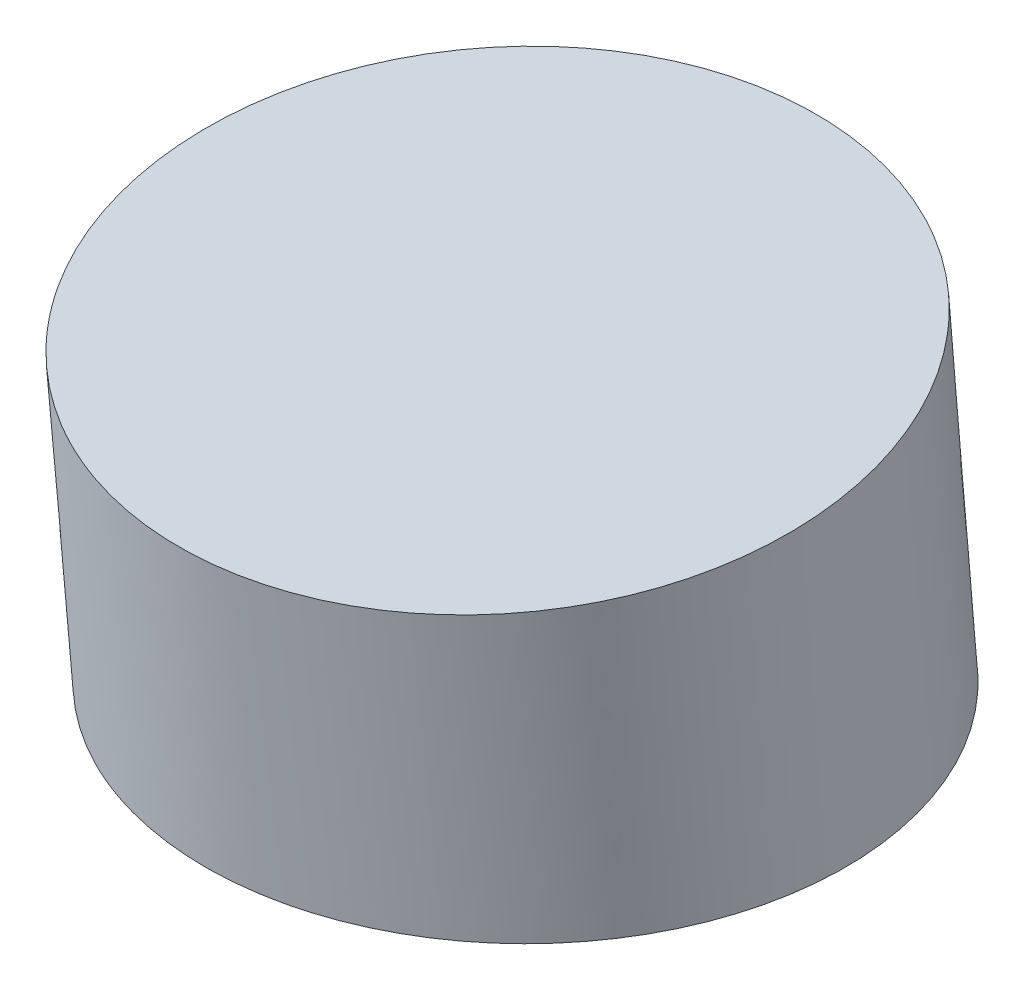
ISO-10303-21;
HEADER;
FILE_DESCRIPTION(('STEP AP214'),'2;1');
FILE_NAME('part.step','',(''),(''),'','','');
FILE_SCHEMA(('AUTOMOTIVE_DESIGN { 1 0 10303 214 1 1 1 1 }'));
ENDSEC;
DATA;
#1=APPLICATION_CONTEXT('core data for automotive mechanical design processes');
#2=APPLICATION_PROTOCOL_DEFINITION('international standard','automotive_design',2000,#1);
#3=PRODUCT_CONTEXT('',#1,'mechanical');
#4=PRODUCT('Part','Part','',(#3));
#5=PRODUCT_RELATED_PRODUCT_CATEGORY('part','',(#4));
#6=PRODUCT_DEFINITION_FORMATION('','',#4);
#7=PRODUCT_DEFINITION_CONTEXT('part definition',#1,'design');
#8=PRODUCT_DEFINITION('design','',#6,#7);
#9=PRODUCT_DEFINITION_SHAPE('','',#8);
#10=(LENGTH_UNIT() NAMED_UNIT(*) SI_UNIT(.MILLI.,.METRE.));
#11=(NAMED_UNIT(*) PLANE_ANGLE_UNIT() SI_UNIT($,.RADIAN.));
#12=(NAMED_UNIT(*) SI_UNIT($,.STERADIAN.) SOLID_ANGLE_UNIT());
#13=UNCERTAINTY_MEASURE_WITH_UNIT(LENGTH_MEASURE(1.E-05),#10,'distance_accuracy_value','');
#14=(GEOMETRIC_REPRESENTATION_CONTEXT(3) GLOBAL_UNCERTAINTY_ASSIGNED_CONTEXT((#13)) GLOBAL_UNIT_ASSIGNED_CONTEXT((#10,
#11,#12)) REPRESENTATION_CONTEXT('',''));
#15=CARTESIAN_POINT('',(0.,0.,0.));
#16=DIRECTION('',(0.,0.,1.));
#17=DIRECTION('',(1.,0.,0.));
#18=AXIS2_PLACEMENT_3D('',#15,#16,#17);
#19=CARTESIAN_POINT('',(0.,4.98097339681643,0.435778705545652));
#20=DIRECTION('',(0.,0.996194698091746,0.0871557427476584));
#21=DIRECTION('',(0.,-0.0871557427476584,0.996194698091746));
#22=AXIS2_PLACEMENT_3D('',#19,#20,#21);
#23=PLANE('',#22);
#24=CARTESIAN_POINT('',(0.,4.98097339681643,0.435778705545652));
#25=DIRECTION('',(0.,0.996194698091746,0.0871557427476584));
#26=DIRECTION('',(0.,-0.0871557427476584,0.996194698091746));
#27=AXIS2_PLACEMENT_3D('',#24,#25,#26);
#28=CIRCLE('',#27,5.);
#29=CARTESIAN_POINT('',(3.08929806545167,5.32362115840022,-3.4807031307812));
#30=VERTEX_POINT('',#29);
#31=EDGE_CURVE('E11',#30,#30,#28,.T.);
#32=ORIENTED_EDGE('',*,*,#31,.T.);
#33=EDGE_LOOP('',(#32));
#34=FACE_BOUND('',#33,.T.);
#35=ADVANCED_FACE('F51',(#34),#23,.T.);
#36=CARTESIAN_POINT('',(0.,0.,0.));
#37=DIRECTION('',(0.,1.,0.));
#38=DIRECTION('',(0.,0.,1.));
#39=AXIS2_PLACEMENT_3D('',#36,#37,#38);
#40=PLANE('',#39);
#41=CARTESIAN_POINT('',(0.,0.,0.));
#42=DIRECTION('',(0.,1.,0.));
#43=DIRECTION('',(0.,0.,1.));
#44=AXIS2_PLACEMENT_3D('',#41,#42,#43);
#45=CIRCLE('',#44,5.);
#46=CARTESIAN_POINT('',(2.88016457511759,0.,-4.0871324935996));
#47=VERTEX_POINT('',#46);
#48=EDGE_CURVE('E59',#47,#47,#45,.T.);
#49=ORIENTED_EDGE('',*,*,#48,.F.);
#50=EDGE_LOOP('',(#49));
#51=FACE_BOUND('',#50,.T.);
#52=ADVANCED_FACE('F82',(#51),#40,.F.);
#53=CARTESIAN_POINT('',(2.88016457511759,0.,-4.0871324935996));
#54=CARTESIAN_POINT('',(3.08929806545167,5.32362115840022,-3.4807031307812));
#55=CARTESIAN_POINT('',(2.53957020065096,0.,-4.32714620819273));
#56=CARTESIAN_POINT('',(2.76167788539475,5.34605866402217,-3.73716499358354));
#57=CARTESIAN_POINT('',(2.12510417655978,0.,-4.55723344620534));
#58=CARTESIAN_POINT('',(2.35976905065111,5.36796780639766,-3.9875876368441));
#59=CARTESIAN_POINT('',(1.36828925257761,0.,-4.81652318923014));
#60=CARTESIAN_POINT('',(1.61749898143795,5.39397399704108,-4.28483975609392));
#61=CARTESIAN_POINT('',(1.09370689539789,0.,-4.88810603896152));
#62=CARTESIAN_POINT('',(1.3470213111716,5.40145184048098,-4.37031189772391));
#63=CARTESIAN_POINT('',(0.502135773344205,0.,-4.98373706030936));
#64=CARTESIAN_POINT('',(0.761239384772058,5.41246289827039,-4.49616886416551));
#65=CARTESIAN_POINT('',(0.185039146597665,0.,-5.00768126235462));
#66=CARTESIAN_POINT('',(0.445821993805979,5.41598755342678,-4.53645585695223));
#67=CARTESIAN_POINT('',(-0.481334818729033,0.,-4.98792821754586));
#68=CARTESIAN_POINT('',(-0.220675681903018,5.41729573969616,-4.55140849443308));
#69=CARTESIAN_POINT('',(-0.830659804252396,0.,-4.94403135551934));
#70=CARTESIAN_POINT('',(-0.57181395411258,5.41506211332025,-4.52587802813164));
#71=CARTESIAN_POINT('',(-1.54041930649647,0.,-4.77080183144637));
#72=CARTESIAN_POINT('',(-1.28963842111728,5.40320923555934,-4.39039901538613));
#73=CARTESIAN_POINT('',(-1.90075097653226,0.,-4.64122103871489));
#74=CARTESIAN_POINT('',(-1.65623484330949,5.39356792031336,-4.28019827785725));
#75=CARTESIAN_POINT('',(-2.60109264735635,0.,-4.28813526429225));
#76=CARTESIAN_POINT('',(-2.37402961394146,5.36601806209837,-3.9653019575262));
#77=CARTESIAN_POINT('',(-2.94081241810053,0.,-4.06447200060502));
#78=CARTESIAN_POINT('',(-2.72494637764674,5.34809442414064,-3.76043383821363));
#79=CARTESIAN_POINT('',(-3.56400954789619,0.,-3.53074301877965));
#80=CARTESIAN_POINT('',(-3.37511784007043,5.30447139827779,-3.26182037099648));
#81=CARTESIAN_POINT('',(-3.84711877900647,0.,-3.22075894958423));
#82=CARTESIAN_POINT('',(-3.67400065522879,5.27877744441176,-2.96813713444296));
#83=CARTESIAN_POINT('',(-4.32714620819273,0.,-2.53957020065096));
#84=CARTESIAN_POINT('',(-4.1888836661374,5.22166948414779,-2.31539016172182));
#85=CARTESIAN_POINT('',(-4.52383717434958,0.,-2.16868797712563));
#86=CARTESIAN_POINT('',(-4.40464013028486,5.19028251110383,-1.95663541820401));
#87=CARTESIAN_POINT('',(-4.81683914253215,0.,-1.40227351009944));
#88=CARTESIAN_POINT('',(-4.73719449033857,5.12490705375517,-1.20939052139198));
#89=CARTESIAN_POINT('',(-4.91319708136079,0.,-1.0071154078386));
#90=CARTESIAN_POINT('',(-4.85401975644937,5.09095134691692,-0.821275016253428));
#91=CARTESIAN_POINT('',(-5.01013280157271,0.,-0.228815024863418));
#92=CARTESIAN_POINT('',(-4.9913940004753,5.02365061369003,-0.052024115455946));
#93=CARTESIAN_POINT('',(-5.01095726703099,0.,0.154107179418879));
#94=CARTESIAN_POINT('',(-5.0121778552113,4.99032586287214,0.328879529369019));
#95=CARTESIAN_POINT('',(-4.93534921936963,0.,0.880777972945864));
#96=CARTESIAN_POINT('',(-4.97455162367227,4.92673493499254,1.05572716101398));
#97=CARTESIAN_POINT('',(-4.85918497290778,0.,1.22451317272553));
#98=CARTESIAN_POINT('',(-4.91640874138956,4.89647114208879,1.40164389678374));
#99=CARTESIAN_POINT('',(-4.65363733959989,0.,1.85870132689271));
#100=CARTESIAN_POINT('',(-4.74419875615282,4.840339313966,2.04323362807688));
#101=CARTESIAN_POINT('',(-4.52442590907287,0.,2.14926629678203));
#102=CARTESIAN_POINT('',(-4.6303092147487,4.81446231044885,2.33900913171663));
#103=CARTESIAN_POINT('',(-4.23537933272021,0.,2.67419844610296));
#104=CARTESIAN_POINT('',(-4.36901863924623,4.76746047654056,2.87624255161411));
#105=CARTESIAN_POINT('',(-4.07560581633799,0.,2.90870217467225));
#106=CARTESIAN_POINT('',(-4.22168626867443,4.74632404127949,3.11783311214201));
#107=CARTESIAN_POINT('',(-3.57685363828636,0.,3.53419898912357));
#108=CARTESIAN_POINT('',(-3.75621730612574,4.68961661119817,3.76600200392672));
#109=CARTESIAN_POINT('',(-3.22075894958423,0.,3.84711877900647));
#110=CARTESIAN_POINT('',(-3.41691824550859,4.66076314085458,4.09579867907017));
#111=CARTESIAN_POINT('',(-2.53957020065096,0.,4.32714620819273));
#112=CARTESIAN_POINT('',(-2.76167788539475,4.61588812961069,4.60872240467484));
#113=CARTESIAN_POINT('',(-2.12510417655978,0.,4.55723344620535));
#114=CARTESIAN_POINT('',(-2.35976905065111,4.59397898723519,4.8591450479354));
#115=CARTESIAN_POINT('',(-1.36828925257761,0.,4.81652318923014));
#116=CARTESIAN_POINT('',(-1.61749898143795,4.56797279659178,5.15639716718522));
#117=CARTESIAN_POINT('',(-1.09370689539789,0.,4.88810603896152));
#118=CARTESIAN_POINT('',(-1.3470213111716,4.56049495315187,5.24186930881521));
#119=CARTESIAN_POINT('',(-0.502135773344204,0.,4.98373706030936));
#120=CARTESIAN_POINT('',(-0.761239384772059,4.54948389536247,5.36772627525681));
#121=CARTESIAN_POINT('',(-0.185039146597665,0.,5.00768126235461));
#122=CARTESIAN_POINT('',(-0.445821993805982,4.54595924020608,5.40801326804354));
#123=CARTESIAN_POINT('',(0.481334818729034,0.,4.98792821754586));
#124=CARTESIAN_POINT('',(0.22067568190302,4.54465105393669,5.42296590552438));
#125=CARTESIAN_POINT('',(0.830659804252394,0.,4.94403135551934));
#126=CARTESIAN_POINT('',(0.571813954112582,4.5468846803126,5.39743543922295));
#127=CARTESIAN_POINT('',(1.54041930649647,0.,4.77080183144637));
#128=CARTESIAN_POINT('',(1.28963842111728,4.55873755807351,5.26195642647743));
#129=CARTESIAN_POINT('',(1.90075097653227,0.,4.64122103871489));
#130=CARTESIAN_POINT('',(1.65623484330949,4.56837887331949,5.15175568894856));
#131=CARTESIAN_POINT('',(2.60109264735635,0.,4.28813526429225));
#132=CARTESIAN_POINT('',(2.37402961394146,4.59592873153448,4.8368593686175));
#133=CARTESIAN_POINT('',(2.94081241810052,0.,4.06447200060502));
#134=CARTESIAN_POINT('',(2.72494637764674,4.61385236949221,4.63199124930494));
#135=CARTESIAN_POINT('',(3.56400954789619,0.,3.53074301877965));
#136=CARTESIAN_POINT('',(3.37511784007044,4.65747539535506,4.13337778208779));
#137=CARTESIAN_POINT('',(3.84711877900647,0.,3.22075894958422));
#138=CARTESIAN_POINT('',(3.67400065522879,4.6831693492211,3.83969454553426));
#139=CARTESIAN_POINT('',(4.32714620819273,0.,2.53957020065096));
#140=CARTESIAN_POINT('',(4.1888836661374,4.74027730948506,3.18694757281312));
#141=CARTESIAN_POINT('',(4.52383717434958,0.,2.16868797712563));
#142=CARTESIAN_POINT('',(4.40464013028486,4.77166428252903,2.82819282929531));
#143=CARTESIAN_POINT('',(4.81683914253215,0.,1.40227351009944));
#144=CARTESIAN_POINT('',(4.73719449033857,4.83703973987768,2.08094793248328));
#145=CARTESIAN_POINT('',(4.91319708136079,0.,1.00711540783859));
#146=CARTESIAN_POINT('',(4.85401975644937,4.87099544671594,1.69283242734473));
#147=CARTESIAN_POINT('',(5.01013280157271,0.,0.228815024863418));
#148=CARTESIAN_POINT('',(4.9913940004753,4.93829617994282,0.923581526547249));
#149=CARTESIAN_POINT('',(5.01095726703098,0.,-0.154107179418882));
#150=CARTESIAN_POINT('',(5.0121778552113,4.97162093076071,0.542677881722285));
#151=CARTESIAN_POINT('',(4.93534921936963,0.,-0.880777972945864));
#152=CARTESIAN_POINT('',(4.97455162367228,5.03521185864031,-0.184169749922676));
#153=CARTESIAN_POINT('',(4.85918497290778,0.,-1.22451317272554));
#154=CARTESIAN_POINT('',(4.91640874138956,5.06547565154406,-0.530086485692441));
#155=CARTESIAN_POINT('',(4.65363733959989,0.,-1.85870132689271));
#156=CARTESIAN_POINT('',(4.74419875615282,5.12160747966685,-1.17167621698558));
#157=CARTESIAN_POINT('',(4.52442590907287,0.,-2.14926629678203));
#158=CARTESIAN_POINT('',(4.63030921474869,5.147484483184,-1.46745172062533));
#159=CARTESIAN_POINT('',(4.23537933272021,0.,-2.67419844610296));
#160=CARTESIAN_POINT('',(4.36901863924623,5.19448631709229,-2.0046851405228));
#161=CARTESIAN_POINT('',(4.07560581633799,0.,-2.90870217467225));
#162=CARTESIAN_POINT('',(4.22168626867443,5.21562275235336,-2.24627570105071));
#163=CARTESIAN_POINT('',(3.57685363828636,0.,-3.53419898912357));
#164=CARTESIAN_POINT('',(3.75621730612574,5.27233018243468,-2.89444459283542));
#165=CARTESIAN_POINT('',(3.22075894958423,0.,-3.84711877900646));
#166=CARTESIAN_POINT('',(3.4169182455086,5.30118365277828,-3.22424126797887));
#167=CARTESIAN_POINT('',(2.88016457511759,0.,-4.0871324935996));
#168=CARTESIAN_POINT('',(3.08929806545167,5.32362115840022,-3.4807031307812));
#169=B_SPLINE_SURFACE_WITH_KNOTS('',3,1,((#53,#54),(#55,#56),(#57,#58),(#59,#60),(#61,#62),(#63,
#64),(#65,#66),(#67,#68),(#69,#70),(#71,#72),(#73,#74),(#75,#76),(#77,#78),(#79,#80),(#81,#82),
(#83,#84),(#85,#86),(#87,#88),(#89,#90),(#91,#92),(#93,#94),(#95,#96),(#97,#98),(#99,#100),
(#101,#102),(#103,#104),(#105,#106),(#107,#108),(#109,#110),(#111,#112),(#113,#114),(#115,#116),
(#117,#118),(#119,#120),(#121,#122),(#123,#124),(#125,#126),(#127,#128),(#129,#130),(#131,#132),
(#133,#134),(#135,#136),(#137,#138),(#139,#140),(#141,#142),(#143,#144),(#145,#146),(#147,#148),
(#149,#150),(#151,#152),(#153,#154),(#155,#156),(#157,#158),(#159,#160),(#161,#162),(#163,#164),
(#165,#166),(#167,#168)),.UNSPECIFIED.,.T.,.F.,.F.,(4,2,2,2,2,2,2,2,2,2,2,2,2,2,2,2,2,2,2,2,2,2,
2,2,2,2,2,2,4),(2,2),(0.,0.0624999999999999,0.0937499999999999,0.125,0.15625,0.1875,0.21875,
0.25,0.28125,0.3125,0.34375,0.375,0.40625,0.4375,0.5,0.5625,0.59375,0.625,0.65625,
0.687499999999999,0.71875,0.75,0.78125,0.8125,0.84375,0.875,0.90625,0.9375,1.),(0.,1.),.UNSPECIFIED.);
#170=CARTESIAN_POINT('',(2.88016457511759,0.,-4.0871324935996));
#171=CARTESIAN_POINT('',(2.88234304897524,0.0554543870666689,-4.08081552107024));
#172=CARTESIAN_POINT('',(2.88452152283289,0.110908774133338,-4.07449854854088));
#173=CARTESIAN_POINT('',(2.88887847054818,0.221817548266676,-4.06186460348216));
#174=CARTESIAN_POINT('',(2.89105694440583,0.277271935333345,-4.05554763095281));
#175=CARTESIAN_POINT('',(2.89541389212112,0.388180709466683,-4.04291368589409));
#176=CARTESIAN_POINT('',(2.89759236597877,0.443635096533352,-4.03659671336473));
#177=CARTESIAN_POINT('',(2.90194931369406,0.55454387066669,-4.02396276830602));
#178=CARTESIAN_POINT('',(2.90412778755171,0.609998257733359,-4.01764579577666));
#179=CARTESIAN_POINT('',(2.908484735267,0.720907031866697,-4.00501185071794));
#180=CARTESIAN_POINT('',(2.91066320912465,0.776361418933366,-3.99869487818858));
#181=CARTESIAN_POINT('',(2.91502015683994,0.887270193066704,-3.98606093312986));
#182=CARTESIAN_POINT('',(2.91719863069759,0.942724580133372,-3.97974396060051));
#183=CARTESIAN_POINT('',(2.92155557841288,1.05363335426671,-3.96711001554179));
#184=CARTESIAN_POINT('',(2.92373405227053,1.10908774133338,-3.96079304301243));
#185=CARTESIAN_POINT('',(2.92809099998582,1.21999651546672,-3.94815909795372));
#186=CARTESIAN_POINT('',(2.93026947384347,1.27545090253339,-3.94184212542436));
#187=CARTESIAN_POINT('',(2.93462642155876,1.38635967666672,-3.92920818036564));
#188=CARTESIAN_POINT('',(2.93680489541641,1.44181406373339,-3.92289120783628));
#189=CARTESIAN_POINT('',(2.9411618431317,1.55272283786673,-3.91025726277757));
#190=CARTESIAN_POINT('',(2.94334031698935,1.6081772249334,-3.90394029024821));
#191=CARTESIAN_POINT('',(2.94769726470464,1.71908599906674,-3.89130634518949));
#192=CARTESIAN_POINT('',(2.94987573856229,1.77454038613341,-3.88498937266013));
#193=CARTESIAN_POINT('',(2.95423268627758,1.88544916026674,-3.87235542760142));
#194=CARTESIAN_POINT('',(2.95641116013523,1.94090354733341,-3.86603845507206));
#195=CARTESIAN_POINT('',(2.96076810785052,2.05181232146675,-3.85340451001334));
#196=CARTESIAN_POINT('',(2.96294658170817,2.10726670853342,-3.84708753748398));
#197=CARTESIAN_POINT('',(2.96730352942346,2.21817548266676,-3.83445359242527));
#198=CARTESIAN_POINT('',(2.96948200328111,2.27362986973343,-3.82813661989591));
#199=CARTESIAN_POINT('',(2.9738389509964,2.38453864386677,-3.81550267483719));
#200=CARTESIAN_POINT('',(2.97601742485405,2.43999303093343,-3.80918570230783));
#201=CARTESIAN_POINT('',(2.98037437256934,2.55090180506677,-3.79655175724912));
#202=CARTESIAN_POINT('',(2.98255284642699,2.60635619213344,-3.79023478471976));
#203=CARTESIAN_POINT('',(2.98690979414228,2.71726496626678,-3.77760083966104));
#204=CARTESIAN_POINT('',(2.98908826799993,2.77271935333345,-3.77128386713168));
#205=CARTESIAN_POINT('',(2.99344521571522,2.88362812746679,-3.75864992207297));
#206=CARTESIAN_POINT('',(2.99562368957287,2.93908251453346,-3.75233294954361));
#207=CARTESIAN_POINT('',(2.99998063728816,3.04999128866679,-3.73969900448489));
#208=CARTESIAN_POINT('',(3.00215911114581,3.10544567573346,-3.73338203195553));
#209=CARTESIAN_POINT('',(3.0065160588611,3.2163544498668,-3.72074808689682));
#210=CARTESIAN_POINT('',(3.00869453271875,3.27180883693347,-3.71443111436746));
#211=CARTESIAN_POINT('',(3.01305148043404,3.38271761106681,-3.70179716930874));
#212=CARTESIAN_POINT('',(3.01522995429168,3.43817199813348,-3.69548019677938));
#213=CARTESIAN_POINT('',(3.01958690200698,3.54908077226681,-3.68284625172067));
#214=CARTESIAN_POINT('',(3.02176537586463,3.60453515933348,-3.67652927919131));
#215=CARTESIAN_POINT('',(3.02612232357992,3.71544393346682,-3.66389533413259));
#216=CARTESIAN_POINT('',(3.02830079743756,3.77089832053349,-3.65757836160323));
#217=CARTESIAN_POINT('',(3.03265774515286,3.88180709466683,-3.64494441654452));
#218=CARTESIAN_POINT('',(3.0348362190105,3.9372614817335,-3.63862744401516));
#219=CARTESIAN_POINT('',(3.0391931667258,4.04817025586683,-3.62599349895644));
#220=CARTESIAN_POINT('',(3.04137164058344,4.1036246429335,-3.61967652642709));
#221=CARTESIAN_POINT('',(3.04572858829874,4.21453341706684,-3.60704258136837));
#222=CARTESIAN_POINT('',(3.04790706215638,4.26998780413351,-3.60072560883901));
#223=CARTESIAN_POINT('',(3.05226400987168,4.38089657826685,-3.58809166378029));
#224=CARTESIAN_POINT('',(3.05444248372932,4.43635096533352,-3.58177469125094));
#225=CARTESIAN_POINT('',(3.05879943144462,4.54725973946686,-3.56914074619222));
#226=CARTESIAN_POINT('',(3.06097790530226,4.60271412653352,-3.56282377366286));
#227=CARTESIAN_POINT('',(3.06533485301756,4.71362290066686,-3.55018982860414));
#228=CARTESIAN_POINT('',(3.0675133268752,4.76907728773353,-3.54387285607479));
#229=CARTESIAN_POINT('',(3.0718702745905,4.87998606186687,-3.53123891101607));
#230=CARTESIAN_POINT('',(3.07404874844814,4.93544044893354,-3.52492193848671));
#231=CARTESIAN_POINT('',(3.07840569616344,5.04634922306688,-3.51228799342799));
#232=CARTESIAN_POINT('',(3.08058417002108,5.10180361013354,-3.50597102089864));
#233=CARTESIAN_POINT('',(3.08494111773638,5.21271238426688,-3.49333707583992));
#234=CARTESIAN_POINT('',(3.08711959159402,5.26816677133355,-3.48702010331056));
#235=CARTESIAN_POINT('',(3.08929806545167,5.32362115840022,-3.4807031307812));
#236=B_SPLINE_CURVE_WITH_KNOTS('',3,(#170,#171,#172,#173,#174,#175,#176,#177,#178,#179,#180,
#181,#182,#183,#184,#185,#186,#187,#188,#189,#190,#191,#192,#193,#194,#195,#196,#197,#198,#199,
#200,#201,#202,#203,#204,#205,#206,#207,#208,#209,#210,#211,#212,#213,#214,#215,#216,#217,#218,
#219,#220,#221,#222,#223,#224,#225,#226,#227,#228,#229,#230,#231,#232,#233,#234,#235),
.UNSPECIFIED.,.F.,.F.,(4,2,2,2,2,2,2,2,2,2,2,2,2,2,2,2,2,2,2,2,2,2,2,2,2,2,2,2,2,2,2,2,4),(0.,
0.167566555186366,0.335133110372733,0.502699665559099,0.670266220745465,0.837832775931831,
1.0053993311182,1.17296588630456,1.34053244149093,1.5080989966773,1.67566555186366,
1.84323210705003,2.0107986622364,2.17836521742276,2.34593177260913,2.51349832779549,
2.68106488298186,2.84863143816823,3.01619799335459,3.18376454854096,3.35133110372733,
3.51889765891369,3.68646421410006,3.85403076928643,4.02159732447279,4.18916387965916,
4.35673043484552,4.52429699003189,4.69186354521825,4.85943010040462,5.02699665559099,
5.19456321077735,5.36212976596372),.UNSPECIFIED.);
#237=EDGE_CURVE('BSEAM90',#47,#30,#236,.T.);
#238=ORIENTED_EDGE('',*,*,#48,.T.);
#239=ORIENTED_EDGE('',*,*,#31,.F.);
#240=ORIENTED_EDGE('',*,*,#237,.T.);
#241=ORIENTED_EDGE('',*,*,#237,.F.);
#242=EDGE_LOOP('',(#238,#240,#239,#241));
#243=FACE_BOUND('',#242,.T.);
#244=ADVANCED_FACE('F90',(#243),#169,.T.);
#245=CLOSED_SHELL('',(#35,#52,#244));
#246=MANIFOLD_SOLID_BREP('B2',#245);
#247=ADVANCED_BREP_SHAPE_REPRESENTATION('',(#18,#246),#14);
#248=SHAPE_DEFINITION_REPRESENTATION(#9,#247);
ENDSEC;
END-ISO-10303-21;
